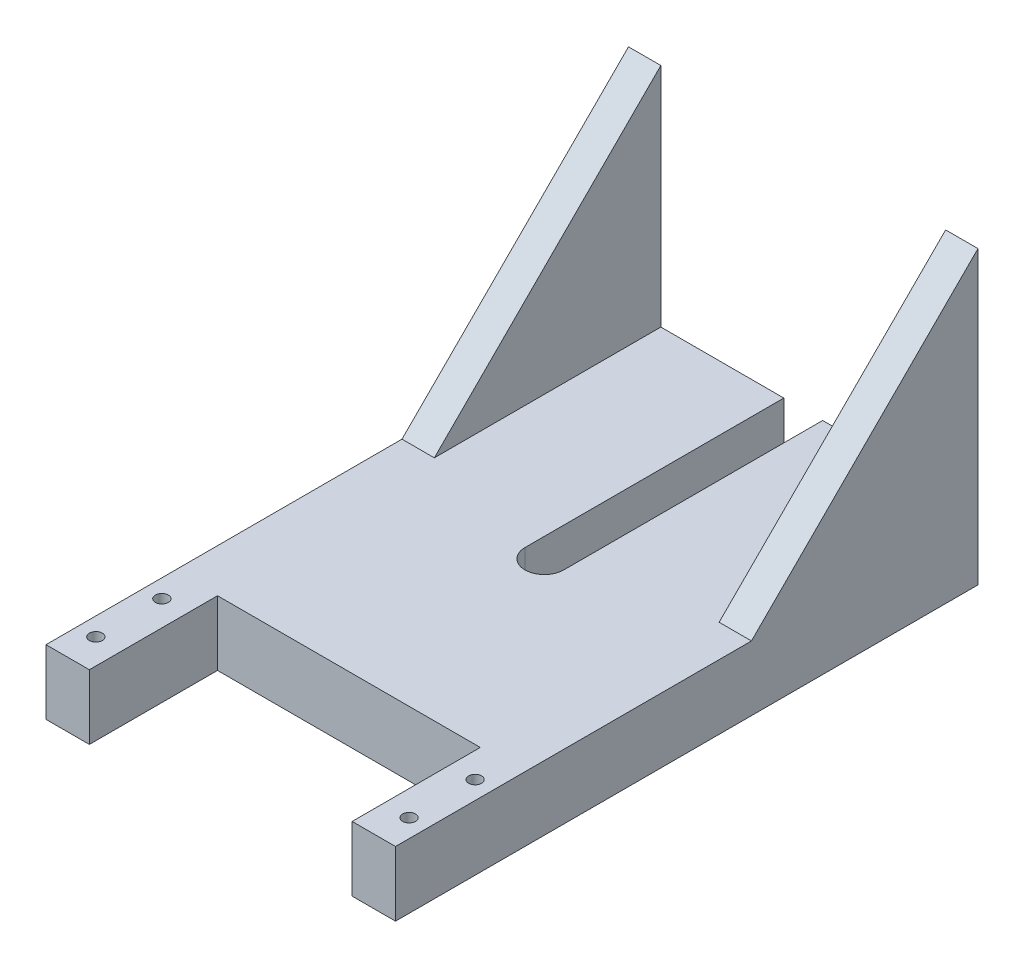
ISO-10303-21;
HEADER;
FILE_DESCRIPTION(('STEP AP214'),'2;1');
FILE_NAME('part.step','',(''),(''),'','','');
FILE_SCHEMA(('AUTOMOTIVE_DESIGN { 1 0 10303 214 1 1 1 1 }'));
ENDSEC;
DATA;
#1=APPLICATION_CONTEXT('core data for automotive mechanical design processes');
#2=APPLICATION_PROTOCOL_DEFINITION('international standard','automotive_design',2000,#1);
#3=PRODUCT_CONTEXT('',#1,'mechanical');
#4=PRODUCT('Part','Part','',(#3));
#5=PRODUCT_RELATED_PRODUCT_CATEGORY('part','',(#4));
#6=PRODUCT_DEFINITION_FORMATION('','',#4);
#7=PRODUCT_DEFINITION_CONTEXT('part definition',#1,'design');
#8=PRODUCT_DEFINITION('design','',#6,#7);
#9=PRODUCT_DEFINITION_SHAPE('','',#8);
#10=(LENGTH_UNIT() NAMED_UNIT(*) SI_UNIT(.MILLI.,.METRE.));
#11=(NAMED_UNIT(*) PLANE_ANGLE_UNIT() SI_UNIT($,.RADIAN.));
#12=(NAMED_UNIT(*) SI_UNIT($,.STERADIAN.) SOLID_ANGLE_UNIT());
#13=UNCERTAINTY_MEASURE_WITH_UNIT(LENGTH_MEASURE(1.E-05),#10,'distance_accuracy_value','');
#14=(GEOMETRIC_REPRESENTATION_CONTEXT(3) GLOBAL_UNCERTAINTY_ASSIGNED_CONTEXT((#13)) GLOBAL_UNIT_ASSIGNED_CONTEXT((#10,
#11,#12)) REPRESENTATION_CONTEXT('',''));
#15=CARTESIAN_POINT('',(0.,0.,0.));
#16=DIRECTION('',(0.,0.,1.));
#17=DIRECTION('',(1.,0.,0.));
#18=AXIS2_PLACEMENT_3D('',#15,#16,#17);
#19=CARTESIAN_POINT('',(-16.0284213442908,532.175634264805,90.));
#20=DIRECTION('',(0.,1.,0.));
#21=DIRECTION('',(0.,0.,1.));
#22=AXIS2_PLACEMENT_3D('',#19,#20,#21);
#23=PLANE('',#22);
#24=CARTESIAN_POINT('',(35.1715786557092,532.175634264805,85.1));
#25=DIRECTION('',(0.,1.,0.));
#26=DIRECTION('',(0.,0.,1.));
#27=AXIS2_PLACEMENT_3D('',#24,#25,#26);
#28=CIRCLE('',#27,0.999999999999998);
#29=CARTESIAN_POINT('',(35.1715786557092,532.175634264805,86.1));
#30=VERTEX_POINT('',#29);
#31=EDGE_CURVE('E199',#30,#30,#28,.T.);
#32=ORIENTED_EDGE('',*,*,#31,.F.);
#33=EDGE_LOOP('',(#32));
#34=FACE_BOUND('',#33,.T.);
#35=CARTESIAN_POINT('',(35.1715786557092,532.175634264805,74.9));
#36=DIRECTION('',(0.,1.,0.));
#37=DIRECTION('',(0.,0.,1.));
#38=AXIS2_PLACEMENT_3D('',#35,#36,#37);
#39=CIRCLE('',#38,0.999999999999998);
#40=CARTESIAN_POINT('',(35.1715786557092,532.175634264805,75.9));
#41=VERTEX_POINT('',#40);
#42=EDGE_CURVE('E202',#41,#41,#39,.T.);
#43=ORIENTED_EDGE('',*,*,#42,.F.);
#44=EDGE_LOOP('',(#43));
#45=FACE_BOUND('',#44,.T.);
#46=CARTESIAN_POINT('',(-13.2284213442908,532.175634264805,74.9));
#47=DIRECTION('',(0.,1.,0.));
#48=DIRECTION('',(0.,0.,1.));
#49=AXIS2_PLACEMENT_3D('',#46,#47,#48);
#50=CIRCLE('',#49,1.);
#51=CARTESIAN_POINT('',(-13.2284213442908,532.175634264805,75.9));
#52=VERTEX_POINT('',#51);
#53=EDGE_CURVE('E369',#52,#52,#50,.T.);
#54=ORIENTED_EDGE('',*,*,#53,.F.);
#55=EDGE_LOOP('',(#54));
#56=FACE_BOUND('',#55,.T.);
#57=CARTESIAN_POINT('',(-13.2284213442908,532.175634264805,85.1));
#58=DIRECTION('',(0.,1.,0.));
#59=DIRECTION('',(0.,0.,1.));
#60=AXIS2_PLACEMENT_3D('',#57,#58,#59);
#61=CIRCLE('',#60,1.);
#62=CARTESIAN_POINT('',(-13.2284213442908,532.175634264805,86.1));
#63=VERTEX_POINT('',#62);
#64=EDGE_CURVE('E366',#63,#63,#61,.T.);
#65=ORIENTED_EDGE('',*,*,#64,.F.);
#66=EDGE_LOOP('',(#65));
#67=FACE_BOUND('',#66,.T.);
#68=DIRECTION('',(1.,0.,0.));
#69=VECTOR('',#68,1.);
#70=CARTESIAN_POINT('',(32.9715786557092,532.175634264805,35.));
#71=LINE('',#70,#69);
#72=CARTESIAN_POINT('',(32.9715786557092,532.175634264805,35.));
#73=VERTEX_POINT('',#72);
#74=CARTESIAN_POINT('',(37.9715786557092,532.175634264805,35.));
#75=VERTEX_POINT('',#74);
#76=EDGE_CURVE('E162',#73,#75,#71,.T.);
#77=ORIENTED_EDGE('',*,*,#76,.F.);
#78=DIRECTION('',(0.,0.,-1.));
#79=VECTOR('',#78,1.);
#80=CARTESIAN_POINT('',(32.9715786557092,532.175634264805,0.));
#81=LINE('',#80,#79);
#82=CARTESIAN_POINT('',(32.9715786557092,532.175634264805,0.));
#83=VERTEX_POINT('',#82);
#84=EDGE_CURVE('E150',#73,#83,#81,.T.);
#85=ORIENTED_EDGE('',*,*,#84,.T.);
#86=DIRECTION('',(1.,0.,0.));
#87=VECTOR('',#86,1.);
#88=CARTESIAN_POINT('',(-16.0284213442908,532.175634264805,0.));
#89=LINE('',#88,#87);
#90=CARTESIAN_POINT('',(13.9715786557092,532.175634264805,0.));
#91=VERTEX_POINT('',#90);
#92=EDGE_CURVE('E160',#91,#83,#89,.T.);
#93=ORIENTED_EDGE('',*,*,#92,.F.);
#94=DIRECTION('',(0.,0.,-1.));
#95=VECTOR('',#94,1.);
#96=CARTESIAN_POINT('',(13.9715786557092,532.175634264805,40.));
#97=LINE('',#96,#95);
#98=CARTESIAN_POINT('',(13.9715786557092,532.175634264805,40.));
#99=VERTEX_POINT('',#98);
#100=EDGE_CURVE('E56',#99,#91,#97,.T.);
#101=ORIENTED_EDGE('',*,*,#100,.F.);
#102=CARTESIAN_POINT('',(10.9715786557092,532.175634264805,40.));
#103=DIRECTION('',(0.,1.,0.));
#104=DIRECTION('',(0.,0.,1.));
#105=AXIS2_PLACEMENT_3D('',#102,#103,#104);
#106=CIRCLE('',#105,2.99999999999998);
#107=CARTESIAN_POINT('',(7.97157865570923,532.175634264805,40.));
#108=VERTEX_POINT('',#107);
#109=EDGE_CURVE('E220',#108,#99,#106,.T.);
#110=ORIENTED_EDGE('',*,*,#109,.F.);
#111=DIRECTION('',(0.,0.,1.));
#112=VECTOR('',#111,1.);
#113=CARTESIAN_POINT('',(7.97157865570923,532.175634264805,40.));
#114=LINE('',#113,#112);
#115=CARTESIAN_POINT('',(7.97157865570923,532.175634264805,0.));
#116=VERTEX_POINT('',#115);
#117=EDGE_CURVE('E226',#116,#108,#114,.T.);
#118=ORIENTED_EDGE('',*,*,#117,.F.);
#119=CARTESIAN_POINT('',(-11.0284213442908,532.175634264805,0.));
#120=VERTEX_POINT('',#119);
#121=EDGE_CURVE('E168',#120,#116,#89,.T.);
#122=ORIENTED_EDGE('',*,*,#121,.F.);
#123=DIRECTION('',(0.,0.,1.));
#124=VECTOR('',#123,1.);
#125=CARTESIAN_POINT('',(-11.0284213442908,532.175634264805,0.));
#126=LINE('',#125,#124);
#127=CARTESIAN_POINT('',(-11.0284213442908,532.175634264805,35.));
#128=VERTEX_POINT('',#127);
#129=EDGE_CURVE('E207',#120,#128,#126,.T.);
#130=ORIENTED_EDGE('',*,*,#129,.T.);
#131=DIRECTION('',(-1.,0.,0.));
#132=VECTOR('',#131,1.);
#133=CARTESIAN_POINT('',(-11.0284213442908,532.175634264805,35.));
#134=LINE('',#133,#132);
#135=CARTESIAN_POINT('',(-16.0284213442908,532.175634264805,35.));
#136=VERTEX_POINT('',#135);
#137=EDGE_CURVE('E216',#128,#136,#134,.T.);
#138=ORIENTED_EDGE('',*,*,#137,.T.);
#139=DIRECTION('',(0.,0.,-1.));
#140=VECTOR('',#139,1.);
#141=CARTESIAN_POINT('',(-16.0284213442908,532.175634264805,90.));
#142=LINE('',#141,#140);
#143=CARTESIAN_POINT('',(-16.0284213442908,532.175634264805,90.));
#144=VERTEX_POINT('',#143);
#145=EDGE_CURVE('E177',#144,#136,#142,.T.);
#146=ORIENTED_EDGE('',*,*,#145,.F.);
#147=DIRECTION('',(1.,0.,0.));
#148=VECTOR('',#147,1.);
#149=CARTESIAN_POINT('',(-16.0284213442908,532.175634264805,90.));
#150=LINE('',#149,#148);
#151=CARTESIAN_POINT('',(-9.32842134429079,532.175634264805,90.));
#152=VERTEX_POINT('',#151);
#153=EDGE_CURVE('E181',#144,#152,#150,.T.);
#154=ORIENTED_EDGE('',*,*,#153,.T.);
#155=DIRECTION('',(0.,0.,-1.));
#156=VECTOR('',#155,1.);
#157=CARTESIAN_POINT('',(-9.32842134429079,532.175634264805,90.));
#158=LINE('',#157,#156);
#159=CARTESIAN_POINT('',(-9.32842134429079,532.175634264805,70.2));
#160=VERTEX_POINT('',#159);
#161=EDGE_CURVE('E246',#152,#160,#158,.T.);
#162=ORIENTED_EDGE('',*,*,#161,.T.);
#163=DIRECTION('',(1.,0.,0.));
#164=VECTOR('',#163,1.);
#165=CARTESIAN_POINT('',(-9.32842134429079,532.175634264805,70.2));
#166=LINE('',#165,#164);
#167=CARTESIAN_POINT('',(31.2715786557092,532.175634264805,70.2));
#168=VERTEX_POINT('',#167);
#169=EDGE_CURVE('E249',#160,#168,#166,.T.);
#170=ORIENTED_EDGE('',*,*,#169,.T.);
#171=DIRECTION('',(0.,0.,1.));
#172=VECTOR('',#171,1.);
#173=CARTESIAN_POINT('',(31.2715786557092,532.175634264805,90.));
#174=LINE('',#173,#172);
#175=CARTESIAN_POINT('',(31.2715786557092,532.175634264805,90.));
#176=VERTEX_POINT('',#175);
#177=EDGE_CURVE('E253',#168,#176,#174,.T.);
#178=ORIENTED_EDGE('',*,*,#177,.T.);
#179=CARTESIAN_POINT('',(37.9715786557092,532.175634264805,90.));
#180=VERTEX_POINT('',#179);
#181=EDGE_CURVE('E279',#176,#180,#150,.T.);
#182=ORIENTED_EDGE('',*,*,#181,.T.);
#183=DIRECTION('',(0.,0.,-1.));
#184=VECTOR('',#183,1.);
#185=CARTESIAN_POINT('',(37.9715786557092,532.175634264805,90.));
#186=LINE('',#185,#184);
#187=EDGE_CURVE('E180',#180,#75,#186,.T.);
#188=ORIENTED_EDGE('',*,*,#187,.T.);
#189=EDGE_LOOP('',(#77,#85,#93,#101,#110,#118,#122,#130,#138,#146,#154,#162,#170,#178,#182,#188));
#190=FACE_BOUND('',#189,.T.);
#191=ADVANCED_FACE('F33',(#34,#45,#56,#67,#190),#23,.T.);
#192=CARTESIAN_POINT('',(0.,0.,0.));
#193=DIRECTION('',(0.,0.,1.));
#194=DIRECTION('',(1.,0.,0.));
#195=AXIS2_PLACEMENT_3D('',#192,#193,#194);
#196=PLANE('',#195);
#197=DIRECTION('',(0.,-1.,0.));
#198=VECTOR('',#197,1.);
#199=CARTESIAN_POINT('',(-16.0284213442908,532.175634264805,0.));
#200=LINE('',#199,#198);
#201=CARTESIAN_POINT('',(-16.0284213442908,567.175634264805,0.));
#202=VERTEX_POINT('',#201);
#203=CARTESIAN_POINT('',(-16.0284213442908,522.175634264805,0.));
#204=VERTEX_POINT('',#203);
#205=EDGE_CURVE('E265',#202,#204,#200,.T.);
#206=ORIENTED_EDGE('',*,*,#205,.F.);
#207=DIRECTION('',(-1.,0.,0.));
#208=VECTOR('',#207,1.);
#209=CARTESIAN_POINT('',(-11.0284213442908,567.175634264805,0.));
#210=LINE('',#209,#208);
#211=CARTESIAN_POINT('',(-11.0284213442908,567.175634264805,0.));
#212=VERTEX_POINT('',#211);
#213=EDGE_CURVE('E218',#212,#202,#210,.T.);
#214=ORIENTED_EDGE('',*,*,#213,.F.);
#215=DIRECTION('',(0.,-1.,0.));
#216=VECTOR('',#215,1.);
#217=CARTESIAN_POINT('',(-11.0284213442908,567.175634264805,0.));
#218=LINE('',#217,#216);
#219=EDGE_CURVE('E213',#212,#120,#218,.T.);
#220=ORIENTED_EDGE('',*,*,#219,.T.);
#221=ORIENTED_EDGE('',*,*,#121,.T.);
#222=DIRECTION('',(0.,1.,0.));
#223=VECTOR('',#222,1.);
#224=CARTESIAN_POINT('',(7.97157865570923,522.175634264805,0.));
#225=LINE('',#224,#223);
#226=CARTESIAN_POINT('',(7.97157865570923,522.175634264805,0.));
#227=VERTEX_POINT('',#226);
#228=EDGE_CURVE('E241',#227,#116,#225,.T.);
#229=ORIENTED_EDGE('',*,*,#228,.F.);
#230=DIRECTION('',(1.,0.,0.));
#231=VECTOR('',#230,1.);
#232=CARTESIAN_POINT('',(-16.0284213442908,522.175634264805,0.));
#233=LINE('',#232,#231);
#234=EDGE_CURVE('E173',#204,#227,#233,.T.);
#235=ORIENTED_EDGE('',*,*,#234,.F.);
#236=EDGE_LOOP('',(#206,#214,#220,#221,#229,#235));
#237=FACE_BOUND('',#236,.T.);
#238=ADVANCED_FACE('F297',(#237),#196,.F.);
#239=CARTESIAN_POINT('',(0.,0.,90.));
#240=DIRECTION('',(0.,0.,1.));
#241=DIRECTION('',(1.,0.,0.));
#242=AXIS2_PLACEMENT_3D('',#239,#240,#241);
#243=PLANE('',#242);
#244=DIRECTION('',(0.,-1.,0.));
#245=VECTOR('',#244,1.);
#246=CARTESIAN_POINT('',(-9.32842134429079,532.175634264805,90.));
#247=LINE('',#246,#245);
#248=CARTESIAN_POINT('',(-9.32842134429079,522.175634264805,90.));
#249=VERTEX_POINT('',#248);
#250=EDGE_CURVE('E263',#152,#249,#247,.T.);
#251=ORIENTED_EDGE('',*,*,#250,.F.);
#252=ORIENTED_EDGE('',*,*,#153,.F.);
#253=DIRECTION('',(0.,-1.,0.));
#254=VECTOR('',#253,1.);
#255=CARTESIAN_POINT('',(-16.0284213442908,532.175634264805,90.));
#256=LINE('',#255,#254);
#257=CARTESIAN_POINT('',(-16.0284213442908,522.175634264805,90.));
#258=VERTEX_POINT('',#257);
#259=EDGE_CURVE('E171',#144,#258,#256,.T.);
#260=ORIENTED_EDGE('',*,*,#259,.T.);
#261=DIRECTION('',(1.,0.,0.));
#262=VECTOR('',#261,1.);
#263=CARTESIAN_POINT('',(-16.0284213442908,522.175634264805,90.));
#264=LINE('',#263,#262);
#265=EDGE_CURVE('E275',#258,#249,#264,.T.);
#266=ORIENTED_EDGE('',*,*,#265,.T.);
#267=EDGE_LOOP('',(#251,#252,#260,#266));
#268=FACE_BOUND('',#267,.T.);
#269=ADVANCED_FACE('F308',(#268),#243,.T.);
#270=CARTESIAN_POINT('',(-16.0284213442908,532.175634264805,90.));
#271=DIRECTION('',(1.,0.,0.));
#272=DIRECTION('',(0.,0.,-1.));
#273=AXIS2_PLACEMENT_3D('',#270,#271,#272);
#274=PLANE('',#273);
#275=ORIENTED_EDGE('',*,*,#205,.T.);
#276=DIRECTION('',(0.,0.,-1.));
#277=VECTOR('',#276,1.);
#278=CARTESIAN_POINT('',(-16.0284213442908,522.175634264805,90.));
#279=LINE('',#278,#277);
#280=EDGE_CURVE('E11',#258,#204,#279,.T.);
#281=ORIENTED_EDGE('',*,*,#280,.F.);
#282=ORIENTED_EDGE('',*,*,#259,.F.);
#283=ORIENTED_EDGE('',*,*,#145,.T.);
#284=DIRECTION('',(0.,0.707106781186548,-0.707106781186547));
#285=VECTOR('',#284,1.);
#286=CARTESIAN_POINT('',(-16.0284213442908,532.175634264805,35.));
#287=LINE('',#286,#285);
#288=EDGE_CURVE('E48',#136,#202,#287,.T.);
#289=ORIENTED_EDGE('',*,*,#288,.T.);
#290=EDGE_LOOP('',(#275,#281,#282,#283,#289));
#291=FACE_BOUND('',#290,.T.);
#292=ADVANCED_FACE('F35',(#291),#274,.F.);
#293=CARTESIAN_POINT('',(-16.0284213442908,522.175634264805,90.));
#294=DIRECTION('',(0.,1.,0.));
#295=DIRECTION('',(0.,0.,1.));
#296=AXIS2_PLACEMENT_3D('',#293,#294,#295);
#297=PLANE('',#296);
#298=CARTESIAN_POINT('',(35.1715786557092,522.175634264805,85.1));
#299=DIRECTION('',(0.,-1.,0.));
#300=DIRECTION('',(0.,0.,-1.));
#301=AXIS2_PLACEMENT_3D('',#298,#299,#300);
#302=CIRCLE('',#301,0.999999999999998);
#303=CARTESIAN_POINT('',(35.1715786557092,522.175634264805,84.1));
#304=VERTEX_POINT('',#303);
#305=EDGE_CURVE('E353',#304,#304,#302,.T.);
#306=ORIENTED_EDGE('',*,*,#305,.F.);
#307=EDGE_LOOP('',(#306));
#308=FACE_BOUND('',#307,.T.);
#309=CARTESIAN_POINT('',(35.1715786557092,522.175634264805,74.9));
#310=DIRECTION('',(0.,-1.,0.));
#311=DIRECTION('',(0.,0.,-1.));
#312=AXIS2_PLACEMENT_3D('',#309,#310,#311);
#313=CIRCLE('',#312,0.999999999999998);
#314=CARTESIAN_POINT('',(35.1715786557092,522.175634264805,73.9));
#315=VERTEX_POINT('',#314);
#316=EDGE_CURVE('E357',#315,#315,#313,.T.);
#317=ORIENTED_EDGE('',*,*,#316,.F.);
#318=EDGE_LOOP('',(#317));
#319=FACE_BOUND('',#318,.T.);
#320=CARTESIAN_POINT('',(-13.2284213442908,522.175634264805,74.9));
#321=DIRECTION('',(0.,-1.,0.));
#322=DIRECTION('',(0.,0.,-1.));
#323=AXIS2_PLACEMENT_3D('',#320,#321,#322);
#324=CIRCLE('',#323,1.);
#325=CARTESIAN_POINT('',(-13.2284213442908,522.175634264805,73.9));
#326=VERTEX_POINT('',#325);
#327=EDGE_CURVE('E361',#326,#326,#324,.T.);
#328=ORIENTED_EDGE('',*,*,#327,.F.);
#329=EDGE_LOOP('',(#328));
#330=FACE_BOUND('',#329,.T.);
#331=CARTESIAN_POINT('',(-13.2284213442908,522.175634264805,85.1));
#332=DIRECTION('',(0.,-1.,0.));
#333=DIRECTION('',(0.,0.,-1.));
#334=AXIS2_PLACEMENT_3D('',#331,#332,#333);
#335=CIRCLE('',#334,1.);
#336=CARTESIAN_POINT('',(-13.2284213442908,522.175634264805,84.1));
#337=VERTEX_POINT('',#336);
#338=EDGE_CURVE('E364',#337,#337,#335,.T.);
#339=ORIENTED_EDGE('',*,*,#338,.F.);
#340=EDGE_LOOP('',(#339));
#341=FACE_BOUND('',#340,.T.);
#342=ORIENTED_EDGE('',*,*,#234,.T.);
#343=DIRECTION('',(0.,0.,1.));
#344=VECTOR('',#343,1.);
#345=CARTESIAN_POINT('',(7.97157865570923,522.175634264805,40.));
#346=LINE('',#345,#344);
#347=CARTESIAN_POINT('',(7.97157865570923,522.175634264805,40.));
#348=VERTEX_POINT('',#347);
#349=EDGE_CURVE('E229',#227,#348,#346,.T.);
#350=ORIENTED_EDGE('',*,*,#349,.T.);
#351=CARTESIAN_POINT('',(10.9715786557092,522.175634264805,40.));
#352=DIRECTION('',(0.,1.,0.));
#353=DIRECTION('',(0.,0.,1.));
#354=AXIS2_PLACEMENT_3D('',#351,#352,#353);
#355=CIRCLE('',#354,2.99999999999998);
#356=CARTESIAN_POINT('',(13.9715786557092,522.175634264805,40.));
#357=VERTEX_POINT('',#356);
#358=EDGE_CURVE('E222',#348,#357,#355,.T.);
#359=ORIENTED_EDGE('',*,*,#358,.T.);
#360=DIRECTION('',(0.,0.,-1.));
#361=VECTOR('',#360,1.);
#362=CARTESIAN_POINT('',(13.9715786557092,522.175634264805,40.));
#363=LINE('',#362,#361);
#364=CARTESIAN_POINT('',(13.9715786557092,522.175634264805,0.));
#365=VERTEX_POINT('',#364);
#366=EDGE_CURVE('E225',#357,#365,#363,.T.);
#367=ORIENTED_EDGE('',*,*,#366,.T.);
#368=CARTESIAN_POINT('',(37.9715786557092,522.175634264805,0.));
#369=VERTEX_POINT('',#368);
#370=EDGE_CURVE('E193',#365,#369,#233,.T.);
#371=ORIENTED_EDGE('',*,*,#370,.T.);
#372=DIRECTION('',(0.,0.,-1.));
#373=VECTOR('',#372,1.);
#374=CARTESIAN_POINT('',(37.9715786557092,522.175634264805,90.));
#375=LINE('',#374,#373);
#376=CARTESIAN_POINT('',(37.9715786557092,522.175634264805,90.));
#377=VERTEX_POINT('',#376);
#378=EDGE_CURVE('E41',#377,#369,#375,.T.);
#379=ORIENTED_EDGE('',*,*,#378,.F.);
#380=CARTESIAN_POINT('',(31.2715786557092,522.175634264805,90.));
#381=VERTEX_POINT('',#380);
#382=EDGE_CURVE('E274',#381,#377,#264,.T.);
#383=ORIENTED_EDGE('',*,*,#382,.F.);
#384=DIRECTION('',(0.,0.,1.));
#385=VECTOR('',#384,1.);
#386=CARTESIAN_POINT('',(31.2715786557092,522.175634264805,90.));
#387=LINE('',#386,#385);
#388=CARTESIAN_POINT('',(31.2715786557092,522.175634264805,70.2));
#389=VERTEX_POINT('',#388);
#390=EDGE_CURVE('E250',#389,#381,#387,.T.);
#391=ORIENTED_EDGE('',*,*,#390,.F.);
#392=DIRECTION('',(1.,0.,0.));
#393=VECTOR('',#392,1.);
#394=CARTESIAN_POINT('',(-9.32842134429079,522.175634264805,70.2));
#395=LINE('',#394,#393);
#396=CARTESIAN_POINT('',(-9.32842134429079,522.175634264805,70.2));
#397=VERTEX_POINT('',#396);
#398=EDGE_CURVE('E259',#397,#389,#395,.T.);
#399=ORIENTED_EDGE('',*,*,#398,.F.);
#400=DIRECTION('',(0.,0.,-1.));
#401=VECTOR('',#400,1.);
#402=CARTESIAN_POINT('',(-9.32842134429079,522.175634264805,90.));
#403=LINE('',#402,#401);
#404=EDGE_CURVE('E240',#249,#397,#403,.T.);
#405=ORIENTED_EDGE('',*,*,#404,.F.);
#406=ORIENTED_EDGE('',*,*,#265,.F.);
#407=ORIENTED_EDGE('',*,*,#280,.T.);
#408=EDGE_LOOP('',(#342,#350,#359,#367,#371,#379,#383,#391,#399,#405,#406,#407));
#409=FACE_BOUND('',#408,.T.);
#410=ADVANCED_FACE('F284',(#308,#319,#330,#341,#409),#297,.F.);
#411=CARTESIAN_POINT('',(37.9715786557092,532.175634264805,90.));
#412=DIRECTION('',(1.,0.,0.));
#413=DIRECTION('',(0.,1.,0.));
#414=AXIS2_PLACEMENT_3D('',#411,#412,#413);
#415=PLANE('',#414);
#416=DIRECTION('',(0.,-1.,0.));
#417=VECTOR('',#416,1.);
#418=CARTESIAN_POINT('',(37.9715786557092,532.175634264805,0.));
#419=LINE('',#418,#417);
#420=CARTESIAN_POINT('',(37.9715786557093,567.175634264805,0.));
#421=VERTEX_POINT('',#420);
#422=EDGE_CURVE('E169',#421,#369,#419,.T.);
#423=ORIENTED_EDGE('',*,*,#422,.F.);
#424=DIRECTION('',(0.,-0.707106781186548,0.707106781186547));
#425=VECTOR('',#424,1.);
#426=CARTESIAN_POINT('',(37.9715786557092,532.175634264805,35.));
#427=LINE('',#426,#425);
#428=EDGE_CURVE('E163',#421,#75,#427,.T.);
#429=ORIENTED_EDGE('',*,*,#428,.T.);
#430=ORIENTED_EDGE('',*,*,#187,.F.);
#431=DIRECTION('',(0.,-1.,0.));
#432=VECTOR('',#431,1.);
#433=CARTESIAN_POINT('',(37.9715786557092,532.175634264805,90.));
#434=LINE('',#433,#432);
#435=EDGE_CURVE('E190',#180,#377,#434,.T.);
#436=ORIENTED_EDGE('',*,*,#435,.T.);
#437=ORIENTED_EDGE('',*,*,#378,.T.);
#438=EDGE_LOOP('',(#423,#429,#430,#436,#437));
#439=FACE_BOUND('',#438,.T.);
#440=ADVANCED_FACE('F186',(#439),#415,.T.);
#441=DIRECTION('',(0.,-1.,0.));
#442=VECTOR('',#441,1.);
#443=CARTESIAN_POINT('',(31.2715786557092,532.175634264805,90.));
#444=LINE('',#443,#442);
#445=EDGE_CURVE('E266',#176,#381,#444,.T.);
#446=ORIENTED_EDGE('',*,*,#445,.T.);
#447=ORIENTED_EDGE('',*,*,#382,.T.);
#448=ORIENTED_EDGE('',*,*,#435,.F.);
#449=ORIENTED_EDGE('',*,*,#181,.F.);
#450=EDGE_LOOP('',(#446,#447,#448,#449));
#451=FACE_BOUND('',#450,.T.);
#452=ADVANCED_FACE('F322',(#451),#243,.T.);
#453=ORIENTED_EDGE('',*,*,#370,.F.);
#454=DIRECTION('',(0.,1.,0.));
#455=VECTOR('',#454,1.);
#456=CARTESIAN_POINT('',(13.9715786557092,522.175634264805,0.));
#457=LINE('',#456,#455);
#458=EDGE_CURVE('E167',#365,#91,#457,.T.);
#459=ORIENTED_EDGE('',*,*,#458,.T.);
#460=ORIENTED_EDGE('',*,*,#92,.T.);
#461=DIRECTION('',(0.,1.,0.));
#462=VECTOR('',#461,1.);
#463=CARTESIAN_POINT('',(32.9715786557093,567.175634264805,0.));
#464=LINE('',#463,#462);
#465=CARTESIAN_POINT('',(32.9715786557093,567.175634264805,0.));
#466=VERTEX_POINT('',#465);
#467=EDGE_CURVE('E147',#83,#466,#464,.T.);
#468=ORIENTED_EDGE('',*,*,#467,.T.);
#469=DIRECTION('',(1.,0.,0.));
#470=VECTOR('',#469,1.);
#471=CARTESIAN_POINT('',(32.9715786557093,567.175634264805,0.));
#472=LINE('',#471,#470);
#473=EDGE_CURVE('E194',#466,#421,#472,.T.);
#474=ORIENTED_EDGE('',*,*,#473,.T.);
#475=ORIENTED_EDGE('',*,*,#422,.T.);
#476=EDGE_LOOP('',(#453,#459,#460,#468,#474,#475));
#477=FACE_BOUND('',#476,.T.);
#478=ADVANCED_FACE('F166',(#477),#196,.F.);
#479=CARTESIAN_POINT('',(-9.32842134429079,532.175634264805,90.));
#480=DIRECTION('',(-1.,0.,0.));
#481=DIRECTION('',(0.,0.,1.));
#482=AXIS2_PLACEMENT_3D('',#479,#480,#481);
#483=PLANE('',#482);
#484=ORIENTED_EDGE('',*,*,#404,.T.);
#485=DIRECTION('',(0.,-1.,0.));
#486=VECTOR('',#485,1.);
#487=CARTESIAN_POINT('',(-9.32842134429079,532.175634264805,70.2));
#488=LINE('',#487,#486);
#489=EDGE_CURVE('E256',#160,#397,#488,.T.);
#490=ORIENTED_EDGE('',*,*,#489,.F.);
#491=ORIENTED_EDGE('',*,*,#161,.F.);
#492=ORIENTED_EDGE('',*,*,#250,.T.);
#493=EDGE_LOOP('',(#484,#490,#491,#492));
#494=FACE_BOUND('',#493,.T.);
#495=ADVANCED_FACE('F311',(#494),#483,.F.);
#496=CARTESIAN_POINT('',(31.2715786557092,532.175634264805,90.));
#497=DIRECTION('',(1.,0.,0.));
#498=DIRECTION('',(0.,0.,-1.));
#499=AXIS2_PLACEMENT_3D('',#496,#497,#498);
#500=PLANE('',#499);
#501=ORIENTED_EDGE('',*,*,#390,.T.);
#502=ORIENTED_EDGE('',*,*,#445,.F.);
#503=ORIENTED_EDGE('',*,*,#177,.F.);
#504=DIRECTION('',(0.,-1.,0.));
#505=VECTOR('',#504,1.);
#506=CARTESIAN_POINT('',(31.2715786557092,532.175634264805,70.2));
#507=LINE('',#506,#505);
#508=EDGE_CURVE('E269',#168,#389,#507,.T.);
#509=ORIENTED_EDGE('',*,*,#508,.T.);
#510=EDGE_LOOP('',(#501,#502,#503,#509));
#511=FACE_BOUND('',#510,.T.);
#512=ADVANCED_FACE('F319',(#511),#500,.F.);
#513=CARTESIAN_POINT('',(-9.32842134429079,532.175634264805,70.2));
#514=DIRECTION('',(0.,0.,-1.));
#515=DIRECTION('',(-1.,0.,0.));
#516=AXIS2_PLACEMENT_3D('',#513,#514,#515);
#517=PLANE('',#516);
#518=ORIENTED_EDGE('',*,*,#398,.T.);
#519=ORIENTED_EDGE('',*,*,#508,.F.);
#520=ORIENTED_EDGE('',*,*,#169,.F.);
#521=ORIENTED_EDGE('',*,*,#489,.T.);
#522=EDGE_LOOP('',(#518,#519,#520,#521));
#523=FACE_BOUND('',#522,.T.);
#524=ADVANCED_FACE('F315',(#523),#517,.F.);
#525=CARTESIAN_POINT('',(10.9715786557092,522.175634264805,40.));
#526=DIRECTION('',(0.,1.,0.));
#527=DIRECTION('',(0.,0.,1.));
#528=AXIS2_PLACEMENT_3D('',#525,#526,#527);
#529=CYLINDRICAL_SURFACE('',#528,2.99999999999998);
#530=ORIENTED_EDGE('',*,*,#109,.T.);
#531=DIRECTION('',(0.,1.,0.));
#532=VECTOR('',#531,1.);
#533=CARTESIAN_POINT('',(13.9715786557092,522.175634264805,40.));
#534=LINE('',#533,#532);
#535=EDGE_CURVE('E232',#357,#99,#534,.T.);
#536=ORIENTED_EDGE('',*,*,#535,.F.);
#537=ORIENTED_EDGE('',*,*,#358,.F.);
#538=DIRECTION('',(0.,1.,0.));
#539=VECTOR('',#538,1.);
#540=CARTESIAN_POINT('',(7.97157865570923,522.175634264805,40.));
#541=LINE('',#540,#539);
#542=EDGE_CURVE('E238',#348,#108,#541,.T.);
#543=ORIENTED_EDGE('',*,*,#542,.T.);
#544=EDGE_LOOP('',(#530,#536,#537,#543));
#545=FACE_BOUND('',#544,.T.);
#546=ADVANCED_FACE('F290',(#545),#529,.F.);
#547=CARTESIAN_POINT('',(7.97157865570923,522.175634264805,40.));
#548=DIRECTION('',(-1.,0.,0.));
#549=DIRECTION('',(0.,0.,1.));
#550=AXIS2_PLACEMENT_3D('',#547,#548,#549);
#551=PLANE('',#550);
#552=ORIENTED_EDGE('',*,*,#117,.T.);
#553=ORIENTED_EDGE('',*,*,#542,.F.);
#554=ORIENTED_EDGE('',*,*,#349,.F.);
#555=ORIENTED_EDGE('',*,*,#228,.T.);
#556=EDGE_LOOP('',(#552,#553,#554,#555));
#557=FACE_BOUND('',#556,.T.);
#558=ADVANCED_FACE('F294',(#557),#551,.F.);
#559=CARTESIAN_POINT('',(13.9715786557092,522.175634264805,40.));
#560=DIRECTION('',(1.,0.,0.));
#561=DIRECTION('',(0.,0.,-1.));
#562=AXIS2_PLACEMENT_3D('',#559,#560,#561);
#563=PLANE('',#562);
#564=ORIENTED_EDGE('',*,*,#100,.T.);
#565=ORIENTED_EDGE('',*,*,#458,.F.);
#566=ORIENTED_EDGE('',*,*,#366,.F.);
#567=ORIENTED_EDGE('',*,*,#535,.T.);
#568=EDGE_LOOP('',(#564,#565,#566,#567));
#569=FACE_BOUND('',#568,.T.);
#570=ADVANCED_FACE('F287',(#569),#563,.F.);
#571=CARTESIAN_POINT('',(-11.0284213442908,532.175634264805,35.));
#572=DIRECTION('',(0.,0.707106781186547,0.707106781186548));
#573=DIRECTION('',(0.,-0.707106781186548,0.707106781186547));
#574=AXIS2_PLACEMENT_3D('',#571,#572,#573);
#575=PLANE('',#574);
#576=ORIENTED_EDGE('',*,*,#288,.F.);
#577=ORIENTED_EDGE('',*,*,#137,.F.);
#578=DIRECTION('',(0.,0.707106781186548,-0.707106781186547));
#579=VECTOR('',#578,1.);
#580=CARTESIAN_POINT('',(-11.0284213442908,532.175634264805,35.));
#581=LINE('',#580,#579);
#582=EDGE_CURVE('E210',#128,#212,#581,.T.);
#583=ORIENTED_EDGE('',*,*,#582,.T.);
#584=ORIENTED_EDGE('',*,*,#213,.T.);
#585=EDGE_LOOP('',(#576,#577,#583,#584));
#586=FACE_BOUND('',#585,.T.);
#587=ADVANCED_FACE('F323',(#586),#575,.T.);
#588=CARTESIAN_POINT('',(-11.0284213442908,0.,0.));
#589=DIRECTION('',(1.,0.,0.));
#590=DIRECTION('',(0.,0.,-1.));
#591=AXIS2_PLACEMENT_3D('',#588,#589,#590);
#592=PLANE('',#591);
#593=ORIENTED_EDGE('',*,*,#129,.F.);
#594=ORIENTED_EDGE('',*,*,#219,.F.);
#595=ORIENTED_EDGE('',*,*,#582,.F.);
#596=EDGE_LOOP('',(#593,#594,#595));
#597=FACE_BOUND('',#596,.T.);
#598=ADVANCED_FACE('F301',(#597),#592,.T.);
#599=CARTESIAN_POINT('',(32.9715786557092,532.175634264805,35.));
#600=DIRECTION('',(0.,0.707106781186547,0.707106781186548));
#601=DIRECTION('',(0.,-0.707106781186548,0.707106781186547));
#602=AXIS2_PLACEMENT_3D('',#599,#600,#601);
#603=PLANE('',#602);
#604=ORIENTED_EDGE('',*,*,#428,.F.);
#605=ORIENTED_EDGE('',*,*,#473,.F.);
#606=DIRECTION('',(0.,-0.707106781186548,0.707106781186547));
#607=VECTOR('',#606,1.);
#608=CARTESIAN_POINT('',(32.9715786557092,532.175634264805,35.));
#609=LINE('',#608,#607);
#610=EDGE_CURVE('E152',#466,#73,#609,.T.);
#611=ORIENTED_EDGE('',*,*,#610,.T.);
#612=ORIENTED_EDGE('',*,*,#76,.T.);
#613=EDGE_LOOP('',(#604,#605,#611,#612));
#614=FACE_BOUND('',#613,.T.);
#615=ADVANCED_FACE('F198',(#614),#603,.T.);
#616=CARTESIAN_POINT('',(32.9715786557088,0.,0.));
#617=DIRECTION('',(1.,0.,0.));
#618=DIRECTION('',(0.,1.,0.));
#619=AXIS2_PLACEMENT_3D('',#616,#617,#618);
#620=PLANE('',#619);
#621=ORIENTED_EDGE('',*,*,#84,.F.);
#622=ORIENTED_EDGE('',*,*,#610,.F.);
#623=ORIENTED_EDGE('',*,*,#467,.F.);
#624=EDGE_LOOP('',(#621,#622,#623));
#625=FACE_BOUND('',#624,.T.);
#626=ADVANCED_FACE('F149',(#625),#620,.F.);
#627=CARTESIAN_POINT('',(-13.2284213442908,567.175634264805,85.1));
#628=DIRECTION('',(0.,-1.,0.));
#629=DIRECTION('',(0.,0.,-1.));
#630=AXIS2_PLACEMENT_3D('',#627,#628,#629);
#631=CYLINDRICAL_SURFACE('',#630,1.);
#632=ORIENTED_EDGE('',*,*,#64,.T.);
#633=EDGE_LOOP('',(#632));
#634=FACE_BOUND('',#633,.T.);
#635=ORIENTED_EDGE('',*,*,#338,.T.);
#636=EDGE_LOOP('',(#635));
#637=FACE_BOUND('',#636,.T.);
#638=ADVANCED_FACE('F387',(#634,#637),#631,.F.);
#639=CARTESIAN_POINT('',(-13.2284213442908,567.175634264805,74.9));
#640=DIRECTION('',(0.,-1.,0.));
#641=DIRECTION('',(0.,0.,-1.));
#642=AXIS2_PLACEMENT_3D('',#639,#640,#641);
#643=CYLINDRICAL_SURFACE('',#642,1.);
#644=ORIENTED_EDGE('',*,*,#53,.T.);
#645=EDGE_LOOP('',(#644));
#646=FACE_BOUND('',#645,.T.);
#647=ORIENTED_EDGE('',*,*,#327,.T.);
#648=EDGE_LOOP('',(#647));
#649=FACE_BOUND('',#648,.T.);
#650=ADVANCED_FACE('F389',(#646,#649),#643,.F.);
#651=CARTESIAN_POINT('',(35.1715786557092,567.175634264805,74.9));
#652=DIRECTION('',(0.,-1.,0.));
#653=DIRECTION('',(0.,0.,-1.));
#654=AXIS2_PLACEMENT_3D('',#651,#652,#653);
#655=CYLINDRICAL_SURFACE('',#654,0.999999999999998);
#656=ORIENTED_EDGE('',*,*,#42,.T.);
#657=EDGE_LOOP('',(#656));
#658=FACE_BOUND('',#657,.T.);
#659=ORIENTED_EDGE('',*,*,#316,.T.);
#660=EDGE_LOOP('',(#659));
#661=FACE_BOUND('',#660,.T.);
#662=ADVANCED_FACE('F380',(#658,#661),#655,.F.);
#663=CARTESIAN_POINT('',(35.1715786557092,567.175634264805,85.1));
#664=DIRECTION('',(0.,-1.,0.));
#665=DIRECTION('',(0.,0.,-1.));
#666=AXIS2_PLACEMENT_3D('',#663,#664,#665);
#667=CYLINDRICAL_SURFACE('',#666,0.999999999999998);
#668=ORIENTED_EDGE('',*,*,#31,.T.);
#669=EDGE_LOOP('',(#668));
#670=FACE_BOUND('',#669,.T.);
#671=ORIENTED_EDGE('',*,*,#305,.T.);
#672=EDGE_LOOP('',(#671));
#673=FACE_BOUND('',#672,.T.);
#674=ADVANCED_FACE('F399',(#670,#673),#667,.F.);
#675=CLOSED_SHELL('',(#191,#238,#269,#292,#410,#440,#452,#478,#495,#512,#524,#546,#558,#570,
#587,#598,#615,#626,#638,#650,#662,#674));
#676=MANIFOLD_SOLID_BREP('B2',#675);
#677=ADVANCED_BREP_SHAPE_REPRESENTATION('',(#18,#676),#14);
#678=SHAPE_DEFINITION_REPRESENTATION(#9,#677);
ENDSEC;
END-ISO-10303-21;
